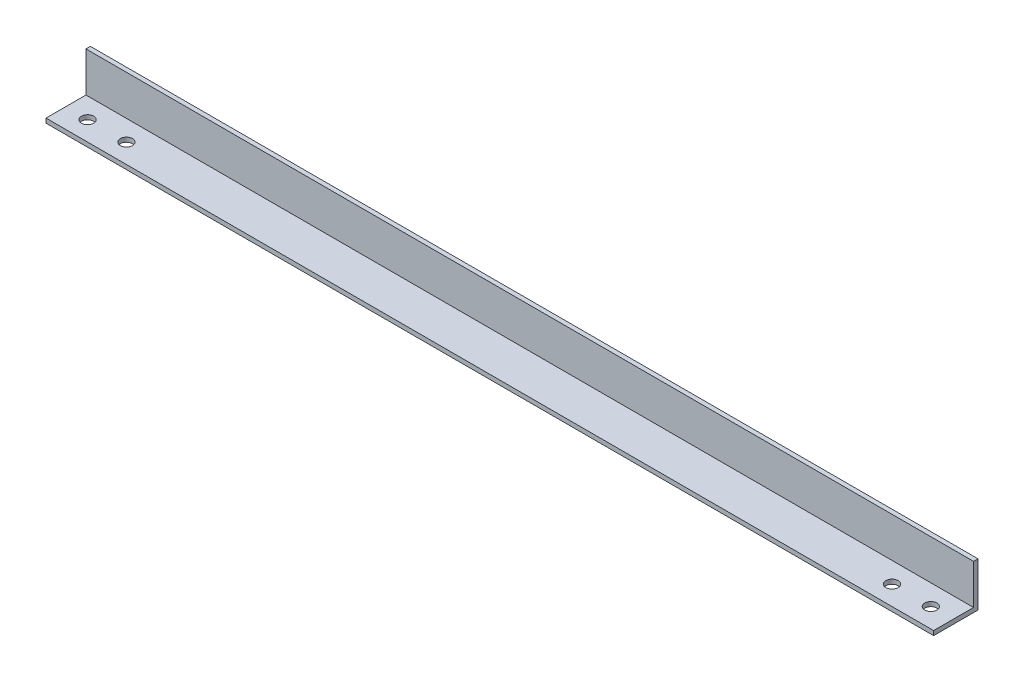
ISO-10303-21;
HEADER;
FILE_DESCRIPTION(('STEP AP214'),'2;1');
FILE_NAME('part.step','',(''),(''),'','','');
FILE_SCHEMA(('AUTOMOTIVE_DESIGN { 1 0 10303 214 1 1 1 1 }'));
ENDSEC;
DATA;
#1=APPLICATION_CONTEXT('core data for automotive mechanical design processes');
#2=APPLICATION_PROTOCOL_DEFINITION('international standard','automotive_design',2000,#1);
#3=PRODUCT_CONTEXT('',#1,'mechanical');
#4=PRODUCT('Part','Part','',(#3));
#5=PRODUCT_RELATED_PRODUCT_CATEGORY('part','',(#4));
#6=PRODUCT_DEFINITION_FORMATION('','',#4);
#7=PRODUCT_DEFINITION_CONTEXT('part definition',#1,'design');
#8=PRODUCT_DEFINITION('design','',#6,#7);
#9=PRODUCT_DEFINITION_SHAPE('','',#8);
#10=(LENGTH_UNIT() NAMED_UNIT(*) SI_UNIT(.MILLI.,.METRE.));
#11=(NAMED_UNIT(*) PLANE_ANGLE_UNIT() SI_UNIT($,.RADIAN.));
#12=(NAMED_UNIT(*) SI_UNIT($,.STERADIAN.) SOLID_ANGLE_UNIT());
#13=UNCERTAINTY_MEASURE_WITH_UNIT(LENGTH_MEASURE(1.E-05),#10,'distance_accuracy_value','');
#14=(GEOMETRIC_REPRESENTATION_CONTEXT(3) GLOBAL_UNCERTAINTY_ASSIGNED_CONTEXT((#13)) GLOBAL_UNIT_ASSIGNED_CONTEXT((#10,
#11,#12)) REPRESENTATION_CONTEXT('',''));
#15=CARTESIAN_POINT('',(0.,0.,0.));
#16=DIRECTION('',(0.,0.,1.));
#17=DIRECTION('',(1.,0.,0.));
#18=AXIS2_PLACEMENT_3D('',#15,#16,#17);
#19=CARTESIAN_POINT('',(0.,80.,8.));
#20=DIRECTION('',(0.,0.,-1.));
#21=DIRECTION('',(-1.,0.,0.));
#22=AXIS2_PLACEMENT_3D('',#19,#20,#21);
#23=PLANE('',#22);
#24=DIRECTION('',(-1.,0.,0.));
#25=VECTOR('',#24,1.);
#26=CARTESIAN_POINT('',(0.,8.00000000000001,8.));
#27=LINE('',#26,#25);
#28=CARTESIAN_POINT('',(1600.,8.00000000000001,8.));
#29=VERTEX_POINT('',#28);
#30=CARTESIAN_POINT('',(0.,8.00000000000001,8.));
#31=VERTEX_POINT('',#30);
#32=EDGE_CURVE('E51',#29,#31,#27,.T.);
#33=ORIENTED_EDGE('',*,*,#32,.F.);
#34=DIRECTION('',(0.,1.,0.));
#35=VECTOR('',#34,1.);
#36=CARTESIAN_POINT('',(1600.,0.,8.));
#37=LINE('',#36,#35);
#38=CARTESIAN_POINT('',(1600.,80.,8.));
#39=VERTEX_POINT('',#38);
#40=EDGE_CURVE('E111',#29,#39,#37,.T.);
#41=ORIENTED_EDGE('',*,*,#40,.T.);
#42=DIRECTION('',(-1.,0.,0.));
#43=VECTOR('',#42,1.);
#44=CARTESIAN_POINT('',(0.,80.,8.));
#45=LINE('',#44,#43);
#46=CARTESIAN_POINT('',(0.,80.,8.));
#47=VERTEX_POINT('',#46);
#48=EDGE_CURVE('E57',#39,#47,#45,.T.);
#49=ORIENTED_EDGE('',*,*,#48,.T.);
#50=DIRECTION('',(0.,-1.,0.));
#51=VECTOR('',#50,1.);
#52=CARTESIAN_POINT('',(0.,0.,8.));
#53=LINE('',#52,#51);
#54=EDGE_CURVE('E86',#47,#31,#53,.T.);
#55=ORIENTED_EDGE('',*,*,#54,.T.);
#56=EDGE_LOOP('',(#33,#41,#49,#55));
#57=FACE_BOUND('',#56,.T.);
#58=ADVANCED_FACE('F34',(#57),#23,.F.);
#59=CARTESIAN_POINT('',(0.,0.,8.));
#60=DIRECTION('',(1.,0.,0.));
#61=DIRECTION('',(0.,0.,-1.));
#62=AXIS2_PLACEMENT_3D('',#59,#60,#61);
#63=PLANE('',#62);
#64=DIRECTION('',(0.,-1.,0.));
#65=VECTOR('',#64,1.);
#66=CARTESIAN_POINT('',(0.,0.,0.));
#67=LINE('',#66,#65);
#68=CARTESIAN_POINT('',(0.,80.,0.));
#69=VERTEX_POINT('',#68);
#70=CARTESIAN_POINT('',(0.,0.,0.));
#71=VERTEX_POINT('',#70);
#72=EDGE_CURVE('E92',#69,#71,#67,.T.);
#73=ORIENTED_EDGE('',*,*,#72,.T.);
#74=DIRECTION('',(0.,0.,-1.));
#75=VECTOR('',#74,1.);
#76=CARTESIAN_POINT('',(0.,0.,8.));
#77=LINE('',#76,#75);
#78=CARTESIAN_POINT('',(0.,0.,80.));
#79=VERTEX_POINT('',#78);
#80=EDGE_CURVE('E11',#79,#71,#77,.T.);
#81=ORIENTED_EDGE('',*,*,#80,.F.);
#82=DIRECTION('',(0.,-1.,0.));
#83=VECTOR('',#82,1.);
#84=CARTESIAN_POINT('',(0.,0.,80.));
#85=LINE('',#84,#83);
#86=CARTESIAN_POINT('',(0.,8.00000000000001,80.));
#87=VERTEX_POINT('',#86);
#88=EDGE_CURVE('E121',#87,#79,#85,.T.);
#89=ORIENTED_EDGE('',*,*,#88,.F.);
#90=DIRECTION('',(0.,0.,-1.));
#91=VECTOR('',#90,1.);
#92=CARTESIAN_POINT('',(0.,8.00000000000001,80.));
#93=LINE('',#92,#91);
#94=EDGE_CURVE('E101',#87,#31,#93,.T.);
#95=ORIENTED_EDGE('',*,*,#94,.T.);
#96=ORIENTED_EDGE('',*,*,#54,.F.);
#97=DIRECTION('',(0.,0.,-1.));
#98=VECTOR('',#97,1.);
#99=CARTESIAN_POINT('',(0.,80.,8.));
#100=LINE('',#99,#98);
#101=EDGE_CURVE('E79',#47,#69,#100,.T.);
#102=ORIENTED_EDGE('',*,*,#101,.T.);
#103=EDGE_LOOP('',(#73,#81,#89,#95,#96,#102));
#104=FACE_BOUND('',#103,.T.);
#105=ADVANCED_FACE('F36',(#104),#63,.F.);
#106=CARTESIAN_POINT('',(0.,0.,8.));
#107=DIRECTION('',(0.,1.,0.));
#108=DIRECTION('',(0.,0.,1.));
#109=AXIS2_PLACEMENT_3D('',#106,#107,#108);
#110=PLANE('',#109);
#111=CARTESIAN_POINT('',(1560.,0.,45.0000000000001));
#112=DIRECTION('',(0.,1.,0.));
#113=DIRECTION('',(0.,0.,1.));
#114=AXIS2_PLACEMENT_3D('',#111,#112,#113);
#115=CIRCLE('',#114,10.9999999999999);
#116=CARTESIAN_POINT('',(1560.,0.,56.));
#117=VERTEX_POINT('',#116);
#118=EDGE_CURVE('E157',#117,#117,#115,.T.);
#119=ORIENTED_EDGE('',*,*,#118,.T.);
#120=EDGE_LOOP('',(#119));
#121=FACE_BOUND('',#120,.T.);
#122=CARTESIAN_POINT('',(1490.,0.,45.0000000000001));
#123=DIRECTION('',(0.,1.,0.));
#124=DIRECTION('',(0.,0.,1.));
#125=AXIS2_PLACEMENT_3D('',#122,#123,#124);
#126=CIRCLE('',#125,10.9999999999999);
#127=CARTESIAN_POINT('',(1490.,0.,56.0000000000001));
#128=VERTEX_POINT('',#127);
#129=EDGE_CURVE('E151',#128,#128,#126,.T.);
#130=ORIENTED_EDGE('',*,*,#129,.T.);
#131=EDGE_LOOP('',(#130));
#132=FACE_BOUND('',#131,.T.);
#133=CARTESIAN_POINT('',(110.,0.,45.0000000000001));
#134=DIRECTION('',(0.,1.,0.));
#135=DIRECTION('',(0.,0.,1.));
#136=AXIS2_PLACEMENT_3D('',#133,#134,#135);
#137=CIRCLE('',#136,11.);
#138=CARTESIAN_POINT('',(110.,0.,56.0000000000002));
#139=VERTEX_POINT('',#138);
#140=EDGE_CURVE('E145',#139,#139,#137,.T.);
#141=ORIENTED_EDGE('',*,*,#140,.T.);
#142=EDGE_LOOP('',(#141));
#143=FACE_BOUND('',#142,.T.);
#144=CARTESIAN_POINT('',(40.0000000000001,0.,45.0000000000001));
#145=DIRECTION('',(0.,1.,0.));
#146=DIRECTION('',(0.,0.,1.));
#147=AXIS2_PLACEMENT_3D('',#144,#145,#146);
#148=CIRCLE('',#147,11.);
#149=CARTESIAN_POINT('',(40.0000000000001,0.,56.0000000000001));
#150=VERTEX_POINT('',#149);
#151=EDGE_CURVE('E122',#150,#150,#148,.T.);
#152=ORIENTED_EDGE('',*,*,#151,.T.);
#153=EDGE_LOOP('',(#152));
#154=FACE_BOUND('',#153,.T.);
#155=DIRECTION('',(1.,0.,0.));
#156=VECTOR('',#155,1.);
#157=CARTESIAN_POINT('',(0.,0.,0.));
#158=LINE('',#157,#156);
#159=CARTESIAN_POINT('',(1600.,0.,0.));
#160=VERTEX_POINT('',#159);
#161=EDGE_CURVE('E96',#71,#160,#158,.T.);
#162=ORIENTED_EDGE('',*,*,#161,.T.);
#163=DIRECTION('',(0.,0.,-1.));
#164=VECTOR('',#163,1.);
#165=CARTESIAN_POINT('',(1600.,0.,8.));
#166=LINE('',#165,#164);
#167=CARTESIAN_POINT('',(1600.,0.,80.));
#168=VERTEX_POINT('',#167);
#169=EDGE_CURVE('E43',#168,#160,#166,.T.);
#170=ORIENTED_EDGE('',*,*,#169,.F.);
#171=DIRECTION('',(1.,0.,0.));
#172=VECTOR('',#171,1.);
#173=CARTESIAN_POINT('',(0.,0.,80.));
#174=LINE('',#173,#172);
#175=EDGE_CURVE('E134',#79,#168,#174,.T.);
#176=ORIENTED_EDGE('',*,*,#175,.F.);
#177=ORIENTED_EDGE('',*,*,#80,.T.);
#178=EDGE_LOOP('',(#162,#170,#176,#177));
#179=FACE_BOUND('',#178,.T.);
#180=ADVANCED_FACE('F166',(#121,#132,#143,#154,#179),#110,.F.);
#181=CARTESIAN_POINT('',(1600.,0.,8.));
#182=DIRECTION('',(-1.,0.,0.));
#183=DIRECTION('',(0.,0.,1.));
#184=AXIS2_PLACEMENT_3D('',#181,#182,#183);
#185=PLANE('',#184);
#186=DIRECTION('',(0.,1.,0.));
#187=VECTOR('',#186,1.);
#188=CARTESIAN_POINT('',(1600.,0.,0.));
#189=LINE('',#188,#187);
#190=CARTESIAN_POINT('',(1600.,80.,0.));
#191=VERTEX_POINT('',#190);
#192=EDGE_CURVE('E87',#160,#191,#189,.T.);
#193=ORIENTED_EDGE('',*,*,#192,.T.);
#194=DIRECTION('',(0.,0.,-1.));
#195=VECTOR('',#194,1.);
#196=CARTESIAN_POINT('',(1600.,80.,8.));
#197=LINE('',#196,#195);
#198=EDGE_CURVE('E82',#39,#191,#197,.T.);
#199=ORIENTED_EDGE('',*,*,#198,.F.);
#200=ORIENTED_EDGE('',*,*,#40,.F.);
#201=DIRECTION('',(0.,0.,-1.));
#202=VECTOR('',#201,1.);
#203=CARTESIAN_POINT('',(1600.,8.00000000000001,80.));
#204=LINE('',#203,#202);
#205=CARTESIAN_POINT('',(1600.,8.00000000000001,80.));
#206=VERTEX_POINT('',#205);
#207=EDGE_CURVE('E97',#206,#29,#204,.T.);
#208=ORIENTED_EDGE('',*,*,#207,.F.);
#209=DIRECTION('',(0.,1.,0.));
#210=VECTOR('',#209,1.);
#211=CARTESIAN_POINT('',(1600.,0.,80.));
#212=LINE('',#211,#210);
#213=EDGE_CURVE('E129',#168,#206,#212,.T.);
#214=ORIENTED_EDGE('',*,*,#213,.F.);
#215=ORIENTED_EDGE('',*,*,#169,.T.);
#216=EDGE_LOOP('',(#193,#199,#200,#208,#214,#215));
#217=FACE_BOUND('',#216,.T.);
#218=ADVANCED_FACE('F197',(#217),#185,.F.);
#219=CARTESIAN_POINT('',(0.,80.,8.));
#220=DIRECTION('',(0.,-1.,0.));
#221=DIRECTION('',(0.,0.,-1.));
#222=AXIS2_PLACEMENT_3D('',#219,#220,#221);
#223=PLANE('',#222);
#224=DIRECTION('',(-1.,0.,0.));
#225=VECTOR('',#224,1.);
#226=CARTESIAN_POINT('',(0.,80.,0.));
#227=LINE('',#226,#225);
#228=EDGE_CURVE('E76',#191,#69,#227,.T.);
#229=ORIENTED_EDGE('',*,*,#228,.T.);
#230=ORIENTED_EDGE('',*,*,#101,.F.);
#231=ORIENTED_EDGE('',*,*,#48,.F.);
#232=ORIENTED_EDGE('',*,*,#198,.T.);
#233=EDGE_LOOP('',(#229,#230,#231,#232));
#234=FACE_BOUND('',#233,.T.);
#235=ADVANCED_FACE('F78',(#234),#223,.F.);
#236=CARTESIAN_POINT('',(0.,80.,0.));
#237=DIRECTION('',(0.,0.,-1.));
#238=DIRECTION('',(-1.,0.,0.));
#239=AXIS2_PLACEMENT_3D('',#236,#237,#238);
#240=PLANE('',#239);
#241=ORIENTED_EDGE('',*,*,#72,.F.);
#242=ORIENTED_EDGE('',*,*,#228,.F.);
#243=ORIENTED_EDGE('',*,*,#192,.F.);
#244=ORIENTED_EDGE('',*,*,#161,.F.);
#245=EDGE_LOOP('',(#241,#242,#243,#244));
#246=FACE_BOUND('',#245,.T.);
#247=ADVANCED_FACE('F95',(#246),#240,.T.);
#248=CARTESIAN_POINT('',(0.,8.00000000000001,80.));
#249=DIRECTION('',(0.,-1.,0.));
#250=DIRECTION('',(0.,0.,-1.));
#251=AXIS2_PLACEMENT_3D('',#248,#249,#250);
#252=PLANE('',#251);
#253=CARTESIAN_POINT('',(1560.,8.00000000000001,45.0000000000001));
#254=DIRECTION('',(0.,1.,0.));
#255=DIRECTION('',(0.,0.,1.));
#256=AXIS2_PLACEMENT_3D('',#253,#254,#255);
#257=CIRCLE('',#256,10.9999999999999);
#258=CARTESIAN_POINT('',(1560.,8.00000000000001,56.));
#259=VERTEX_POINT('',#258);
#260=EDGE_CURVE('E160',#259,#259,#257,.T.);
#261=ORIENTED_EDGE('',*,*,#260,.F.);
#262=EDGE_LOOP('',(#261));
#263=FACE_BOUND('',#262,.T.);
#264=CARTESIAN_POINT('',(1490.,8.00000000000001,45.0000000000001));
#265=DIRECTION('',(0.,1.,0.));
#266=DIRECTION('',(0.,0.,1.));
#267=AXIS2_PLACEMENT_3D('',#264,#265,#266);
#268=CIRCLE('',#267,10.9999999999999);
#269=CARTESIAN_POINT('',(1490.,8.00000000000001,56.0000000000001));
#270=VERTEX_POINT('',#269);
#271=EDGE_CURVE('E154',#270,#270,#268,.T.);
#272=ORIENTED_EDGE('',*,*,#271,.F.);
#273=EDGE_LOOP('',(#272));
#274=FACE_BOUND('',#273,.T.);
#275=CARTESIAN_POINT('',(110.,8.00000000000001,45.0000000000001));
#276=DIRECTION('',(0.,1.,0.));
#277=DIRECTION('',(0.,0.,1.));
#278=AXIS2_PLACEMENT_3D('',#275,#276,#277);
#279=CIRCLE('',#278,11.);
#280=CARTESIAN_POINT('',(110.,8.00000000000001,56.0000000000002));
#281=VERTEX_POINT('',#280);
#282=EDGE_CURVE('E148',#281,#281,#279,.T.);
#283=ORIENTED_EDGE('',*,*,#282,.F.);
#284=EDGE_LOOP('',(#283));
#285=FACE_BOUND('',#284,.T.);
#286=CARTESIAN_POINT('',(40.0000000000001,8.00000000000001,45.0000000000001));
#287=DIRECTION('',(0.,1.,0.));
#288=DIRECTION('',(0.,0.,1.));
#289=AXIS2_PLACEMENT_3D('',#286,#287,#288);
#290=CIRCLE('',#289,11.);
#291=CARTESIAN_POINT('',(40.0000000000001,8.00000000000001,56.0000000000001));
#292=VERTEX_POINT('',#291);
#293=EDGE_CURVE('E142',#292,#292,#290,.T.);
#294=ORIENTED_EDGE('',*,*,#293,.F.);
#295=EDGE_LOOP('',(#294));
#296=FACE_BOUND('',#295,.T.);
#297=ORIENTED_EDGE('',*,*,#32,.T.);
#298=ORIENTED_EDGE('',*,*,#94,.F.);
#299=DIRECTION('',(-1.,0.,0.));
#300=VECTOR('',#299,1.);
#301=CARTESIAN_POINT('',(0.,8.00000000000001,80.));
#302=LINE('',#301,#300);
#303=EDGE_CURVE('E118',#206,#87,#302,.T.);
#304=ORIENTED_EDGE('',*,*,#303,.F.);
#305=ORIENTED_EDGE('',*,*,#207,.T.);
#306=EDGE_LOOP('',(#297,#298,#304,#305));
#307=FACE_BOUND('',#306,.T.);
#308=ADVANCED_FACE('F176',(#263,#274,#285,#296,#307),#252,.F.);
#309=CARTESIAN_POINT('',(0.,8.00000000000001,80.));
#310=DIRECTION('',(0.,0.,-1.));
#311=DIRECTION('',(-1.,0.,0.));
#312=AXIS2_PLACEMENT_3D('',#309,#310,#311);
#313=PLANE('',#312);
#314=ORIENTED_EDGE('',*,*,#88,.T.);
#315=ORIENTED_EDGE('',*,*,#175,.T.);
#316=ORIENTED_EDGE('',*,*,#213,.T.);
#317=ORIENTED_EDGE('',*,*,#303,.T.);
#318=EDGE_LOOP('',(#314,#315,#316,#317));
#319=FACE_BOUND('',#318,.T.);
#320=ADVANCED_FACE('F179',(#319),#313,.F.);
#321=CARTESIAN_POINT('',(40.0000000000001,0.,45.0000000000001));
#322=DIRECTION('',(0.,1.,0.));
#323=DIRECTION('',(0.,0.,1.));
#324=AXIS2_PLACEMENT_3D('',#321,#322,#323);
#325=CYLINDRICAL_SURFACE('',#324,11.);
#326=ORIENTED_EDGE('',*,*,#151,.F.);
#327=EDGE_LOOP('',(#326));
#328=FACE_BOUND('',#327,.T.);
#329=ORIENTED_EDGE('',*,*,#293,.T.);
#330=EDGE_LOOP('',(#329));
#331=FACE_BOUND('',#330,.T.);
#332=ADVANCED_FACE('F238',(#328,#331),#325,.F.);
#333=CARTESIAN_POINT('',(110.,0.,45.0000000000001));
#334=DIRECTION('',(0.,1.,0.));
#335=DIRECTION('',(0.,0.,1.));
#336=AXIS2_PLACEMENT_3D('',#333,#334,#335);
#337=CYLINDRICAL_SURFACE('',#336,11.);
#338=ORIENTED_EDGE('',*,*,#140,.F.);
#339=EDGE_LOOP('',(#338));
#340=FACE_BOUND('',#339,.T.);
#341=ORIENTED_EDGE('',*,*,#282,.T.);
#342=EDGE_LOOP('',(#341));
#343=FACE_BOUND('',#342,.T.);
#344=ADVANCED_FACE('F243',(#340,#343),#337,.F.);
#345=CARTESIAN_POINT('',(1490.,0.,45.0000000000001));
#346=DIRECTION('',(0.,1.,0.));
#347=DIRECTION('',(0.,0.,1.));
#348=AXIS2_PLACEMENT_3D('',#345,#346,#347);
#349=CYLINDRICAL_SURFACE('',#348,10.9999999999999);
#350=ORIENTED_EDGE('',*,*,#129,.F.);
#351=EDGE_LOOP('',(#350));
#352=FACE_BOUND('',#351,.T.);
#353=ORIENTED_EDGE('',*,*,#271,.T.);
#354=EDGE_LOOP('',(#353));
#355=FACE_BOUND('',#354,.T.);
#356=ADVANCED_FACE('F172',(#352,#355),#349,.F.);
#357=CARTESIAN_POINT('',(1560.,0.,45.0000000000001));
#358=DIRECTION('',(0.,1.,0.));
#359=DIRECTION('',(0.,0.,1.));
#360=AXIS2_PLACEMENT_3D('',#357,#358,#359);
#361=CYLINDRICAL_SURFACE('',#360,10.9999999999999);
#362=ORIENTED_EDGE('',*,*,#118,.F.);
#363=EDGE_LOOP('',(#362));
#364=FACE_BOUND('',#363,.T.);
#365=ORIENTED_EDGE('',*,*,#260,.T.);
#366=EDGE_LOOP('',(#365));
#367=FACE_BOUND('',#366,.T.);
#368=ADVANCED_FACE('F169',(#364,#367),#361,.F.);
#369=CLOSED_SHELL('',(#58,#105,#180,#218,#235,#247,#308,#320,#332,#344,#356,#368));
#370=MANIFOLD_SOLID_BREP('B2',#369);
#371=ADVANCED_BREP_SHAPE_REPRESENTATION('',(#18,#370),#14);
#372=SHAPE_DEFINITION_REPRESENTATION(#9,#371);
ENDSEC;
END-ISO-10303-21;
